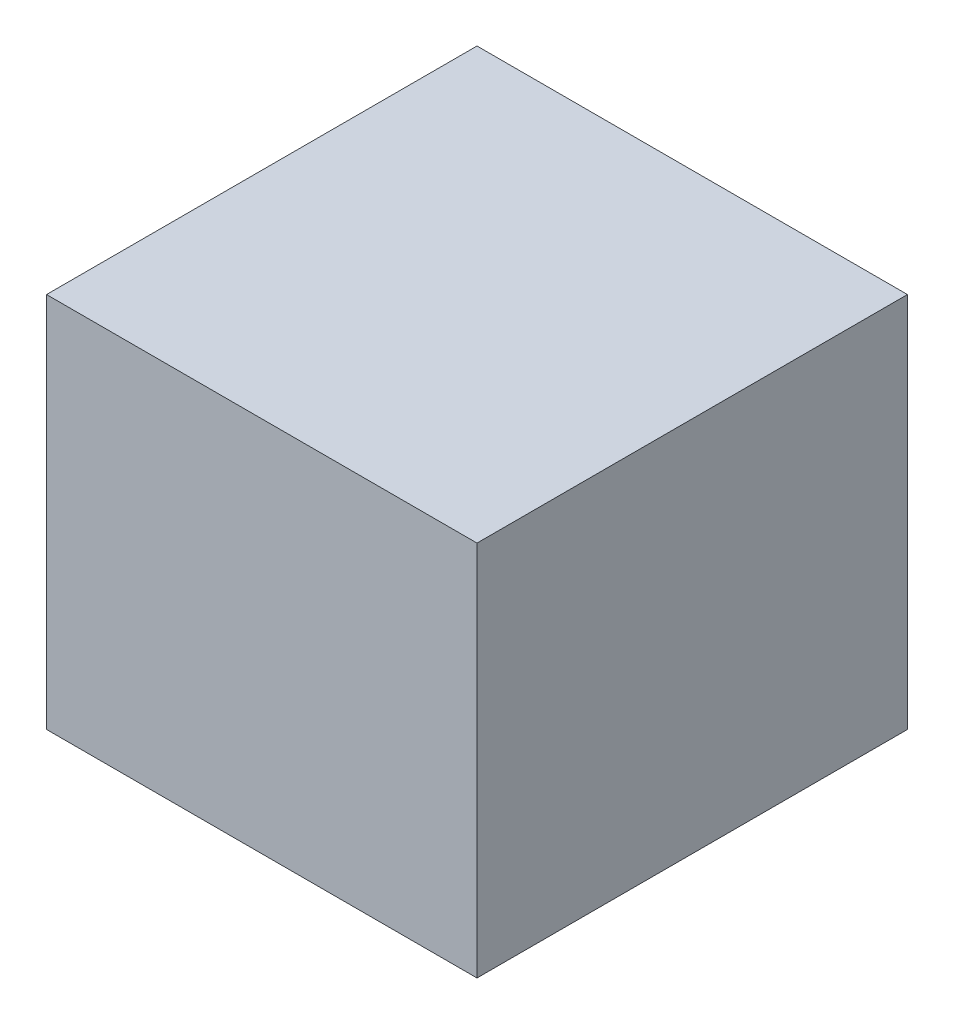
ISO-10303-21;
HEADER;
FILE_DESCRIPTION(('STEP AP214'),'2;1');
FILE_NAME('part.step','',(''),(''),'','','');
FILE_SCHEMA(('AUTOMOTIVE_DESIGN { 1 0 10303 214 1 1 1 1 }'));
ENDSEC;
DATA;
#1=APPLICATION_CONTEXT('core data for automotive mechanical design processes');
#2=APPLICATION_PROTOCOL_DEFINITION('international standard','automotive_design',2000,#1);
#3=PRODUCT_CONTEXT('',#1,'mechanical');
#4=PRODUCT('Part','Part','',(#3));
#5=PRODUCT_RELATED_PRODUCT_CATEGORY('part','',(#4));
#6=PRODUCT_DEFINITION_FORMATION('','',#4);
#7=PRODUCT_DEFINITION_CONTEXT('part definition',#1,'design');
#8=PRODUCT_DEFINITION('design','',#6,#7);
#9=PRODUCT_DEFINITION_SHAPE('','',#8);
#10=(LENGTH_UNIT() NAMED_UNIT(*) SI_UNIT(.MILLI.,.METRE.));
#11=(NAMED_UNIT(*) PLANE_ANGLE_UNIT() SI_UNIT($,.RADIAN.));
#12=(NAMED_UNIT(*) SI_UNIT($,.STERADIAN.) SOLID_ANGLE_UNIT());
#13=UNCERTAINTY_MEASURE_WITH_UNIT(LENGTH_MEASURE(1.E-05),#10,'distance_accuracy_value','');
#14=(GEOMETRIC_REPRESENTATION_CONTEXT(3) GLOBAL_UNCERTAINTY_ASSIGNED_CONTEXT((#13)) GLOBAL_UNIT_ASSIGNED_CONTEXT((#10,
#11,#12)) REPRESENTATION_CONTEXT('',''));
#15=CARTESIAN_POINT('',(0.,0.,0.));
#16=DIRECTION('',(0.,0.,1.));
#17=DIRECTION('',(1.,0.,0.));
#18=AXIS2_PLACEMENT_3D('',#15,#16,#17);
#19=CARTESIAN_POINT('',(-50.8077994428969,35.,-15.5431754874652));
#20=DIRECTION('',(1.,0.,0.));
#21=DIRECTION('',(0.,0.,-1.));
#22=AXIS2_PLACEMENT_3D('',#19,#20,#21);
#23=PLANE('',#22);
#24=DIRECTION('',(0.,0.,1.));
#25=VECTOR('',#24,1.);
#26=CARTESIAN_POINT('',(-50.8077994428969,0.,-15.5431754874652));
#27=LINE('',#26,#25);
#28=CARTESIAN_POINT('',(-50.8077994428969,0.,-15.5431754874652));
#29=VERTEX_POINT('',#28);
#30=CARTESIAN_POINT('',(-50.8077994428969,0.,24.4568245125348));
#31=VERTEX_POINT('',#30);
#32=EDGE_CURVE('E98',#29,#31,#27,.T.);
#33=ORIENTED_EDGE('',*,*,#32,.T.);
#34=DIRECTION('',(0.,-1.,0.));
#35=VECTOR('',#34,1.);
#36=CARTESIAN_POINT('',(-50.8077994428969,35.,24.4568245125348));
#37=LINE('',#36,#35);
#38=CARTESIAN_POINT('',(-50.8077994428969,35.,24.4568245125348));
#39=VERTEX_POINT('',#38);
#40=EDGE_CURVE('E11',#39,#31,#37,.T.);
#41=ORIENTED_EDGE('',*,*,#40,.F.);
#42=DIRECTION('',(0.,0.,1.));
#43=VECTOR('',#42,1.);
#44=CARTESIAN_POINT('',(-50.8077994428969,35.,-15.5431754874652));
#45=LINE('',#44,#43);
#46=CARTESIAN_POINT('',(-50.8077994428969,35.,-15.5431754874652));
#47=VERTEX_POINT('',#46);
#48=EDGE_CURVE('E86',#47,#39,#45,.T.);
#49=ORIENTED_EDGE('',*,*,#48,.F.);
#50=DIRECTION('',(0.,-1.,0.));
#51=VECTOR('',#50,1.);
#52=CARTESIAN_POINT('',(-50.8077994428969,35.,-15.5431754874652));
#53=LINE('',#52,#51);
#54=EDGE_CURVE('E94',#47,#29,#53,.T.);
#55=ORIENTED_EDGE('',*,*,#54,.T.);
#56=EDGE_LOOP('',(#33,#41,#49,#55));
#57=FACE_BOUND('',#56,.T.);
#58=ADVANCED_FACE('F35',(#57),#23,.F.);
#59=CARTESIAN_POINT('',(-50.8077994428969,35.,24.4568245125348));
#60=DIRECTION('',(0.,0.,-1.));
#61=DIRECTION('',(-1.,0.,0.));
#62=AXIS2_PLACEMENT_3D('',#59,#60,#61);
#63=PLANE('',#62);
#64=DIRECTION('',(1.,0.,0.));
#65=VECTOR('',#64,1.);
#66=CARTESIAN_POINT('',(-50.8077994428969,0.,24.4568245125348));
#67=LINE('',#66,#65);
#68=CARTESIAN_POINT('',(-10.8077994428969,0.,24.4568245125348));
#69=VERTEX_POINT('',#68);
#70=EDGE_CURVE('E90',#31,#69,#67,.T.);
#71=ORIENTED_EDGE('',*,*,#70,.T.);
#72=DIRECTION('',(0.,-1.,0.));
#73=VECTOR('',#72,1.);
#74=CARTESIAN_POINT('',(-10.8077994428969,35.,24.4568245125348));
#75=LINE('',#74,#73);
#76=CARTESIAN_POINT('',(-10.8077994428969,35.,24.4568245125348));
#77=VERTEX_POINT('',#76);
#78=EDGE_CURVE('E43',#77,#69,#75,.T.);
#79=ORIENTED_EDGE('',*,*,#78,.F.);
#80=DIRECTION('',(1.,0.,0.));
#81=VECTOR('',#80,1.);
#82=CARTESIAN_POINT('',(-50.8077994428969,35.,24.4568245125348));
#83=LINE('',#82,#81);
#84=EDGE_CURVE('E81',#39,#77,#83,.T.);
#85=ORIENTED_EDGE('',*,*,#84,.F.);
#86=ORIENTED_EDGE('',*,*,#40,.T.);
#87=EDGE_LOOP('',(#71,#79,#85,#86));
#88=FACE_BOUND('',#87,.T.);
#89=ADVANCED_FACE('F89',(#88),#63,.F.);
#90=CARTESIAN_POINT('',(-10.8077994428969,35.,-15.5431754874652));
#91=DIRECTION('',(-1.,0.,0.));
#92=DIRECTION('',(0.,0.,1.));
#93=AXIS2_PLACEMENT_3D('',#90,#91,#92);
#94=PLANE('',#93);
#95=DIRECTION('',(0.,0.,-1.));
#96=VECTOR('',#95,1.);
#97=CARTESIAN_POINT('',(-10.8077994428969,0.,-15.5431754874652));
#98=LINE('',#97,#96);
#99=CARTESIAN_POINT('',(-10.8077994428969,0.,-15.5431754874652));
#100=VERTEX_POINT('',#99);
#101=EDGE_CURVE('E68',#69,#100,#98,.T.);
#102=ORIENTED_EDGE('',*,*,#101,.T.);
#103=DIRECTION('',(0.,-1.,0.));
#104=VECTOR('',#103,1.);
#105=CARTESIAN_POINT('',(-10.8077994428969,35.,-15.5431754874652));
#106=LINE('',#105,#104);
#107=CARTESIAN_POINT('',(-10.8077994428969,35.,-15.5431754874652));
#108=VERTEX_POINT('',#107);
#109=EDGE_CURVE('E91',#108,#100,#106,.T.);
#110=ORIENTED_EDGE('',*,*,#109,.F.);
#111=DIRECTION('',(0.,0.,-1.));
#112=VECTOR('',#111,1.);
#113=CARTESIAN_POINT('',(-10.8077994428969,35.,-15.5431754874652));
#114=LINE('',#113,#112);
#115=EDGE_CURVE('E84',#77,#108,#114,.T.);
#116=ORIENTED_EDGE('',*,*,#115,.F.);
#117=ORIENTED_EDGE('',*,*,#78,.T.);
#118=EDGE_LOOP('',(#102,#110,#116,#117));
#119=FACE_BOUND('',#118,.T.);
#120=ADVANCED_FACE('F92',(#119),#94,.F.);
#121=CARTESIAN_POINT('',(-50.8077994428969,35.,-15.5431754874652));
#122=DIRECTION('',(0.,0.,1.));
#123=DIRECTION('',(1.,0.,0.));
#124=AXIS2_PLACEMENT_3D('',#121,#122,#123);
#125=PLANE('',#124);
#126=DIRECTION('',(-1.,0.,0.));
#127=VECTOR('',#126,1.);
#128=CARTESIAN_POINT('',(-50.8077994428969,0.,-15.5431754874652));
#129=LINE('',#128,#127);
#130=EDGE_CURVE('E74',#100,#29,#129,.T.);
#131=ORIENTED_EDGE('',*,*,#130,.T.);
#132=ORIENTED_EDGE('',*,*,#54,.F.);
#133=DIRECTION('',(-1.,0.,0.));
#134=VECTOR('',#133,1.);
#135=CARTESIAN_POINT('',(-50.8077994428969,35.,-15.5431754874652));
#136=LINE('',#135,#134);
#137=EDGE_CURVE('E51',#108,#47,#136,.T.);
#138=ORIENTED_EDGE('',*,*,#137,.F.);
#139=ORIENTED_EDGE('',*,*,#109,.T.);
#140=EDGE_LOOP('',(#131,#132,#138,#139));
#141=FACE_BOUND('',#140,.T.);
#142=ADVANCED_FACE('F105',(#141),#125,.F.);
#143=CARTESIAN_POINT('',(0.,35.,0.));
#144=DIRECTION('',(0.,1.,0.));
#145=DIRECTION('',(0.,0.,1.));
#146=AXIS2_PLACEMENT_3D('',#143,#144,#145);
#147=PLANE('',#146);
#148=ORIENTED_EDGE('',*,*,#48,.T.);
#149=ORIENTED_EDGE('',*,*,#84,.T.);
#150=ORIENTED_EDGE('',*,*,#115,.T.);
#151=ORIENTED_EDGE('',*,*,#137,.T.);
#152=EDGE_LOOP('',(#148,#149,#150,#151));
#153=FACE_BOUND('',#152,.T.);
#154=ADVANCED_FACE('F82',(#153),#147,.T.);
#155=CARTESIAN_POINT('',(0.,0.,0.));
#156=DIRECTION('',(0.,1.,0.));
#157=DIRECTION('',(0.,0.,1.));
#158=AXIS2_PLACEMENT_3D('',#155,#156,#157);
#159=PLANE('',#158);
#160=ORIENTED_EDGE('',*,*,#32,.F.);
#161=ORIENTED_EDGE('',*,*,#130,.F.);
#162=ORIENTED_EDGE('',*,*,#101,.F.);
#163=ORIENTED_EDGE('',*,*,#70,.F.);
#164=EDGE_LOOP('',(#160,#161,#162,#163));
#165=FACE_BOUND('',#164,.T.);
#166=ADVANCED_FACE('F108',(#165),#159,.F.);
#167=CLOSED_SHELL('',(#58,#89,#120,#142,#154,#166));
#168=MANIFOLD_SOLID_BREP('B2',#167);
#169=ADVANCED_BREP_SHAPE_REPRESENTATION('',(#18,#168),#14);
#170=SHAPE_DEFINITION_REPRESENTATION(#9,#169);
ENDSEC;
END-ISO-10303-21;
